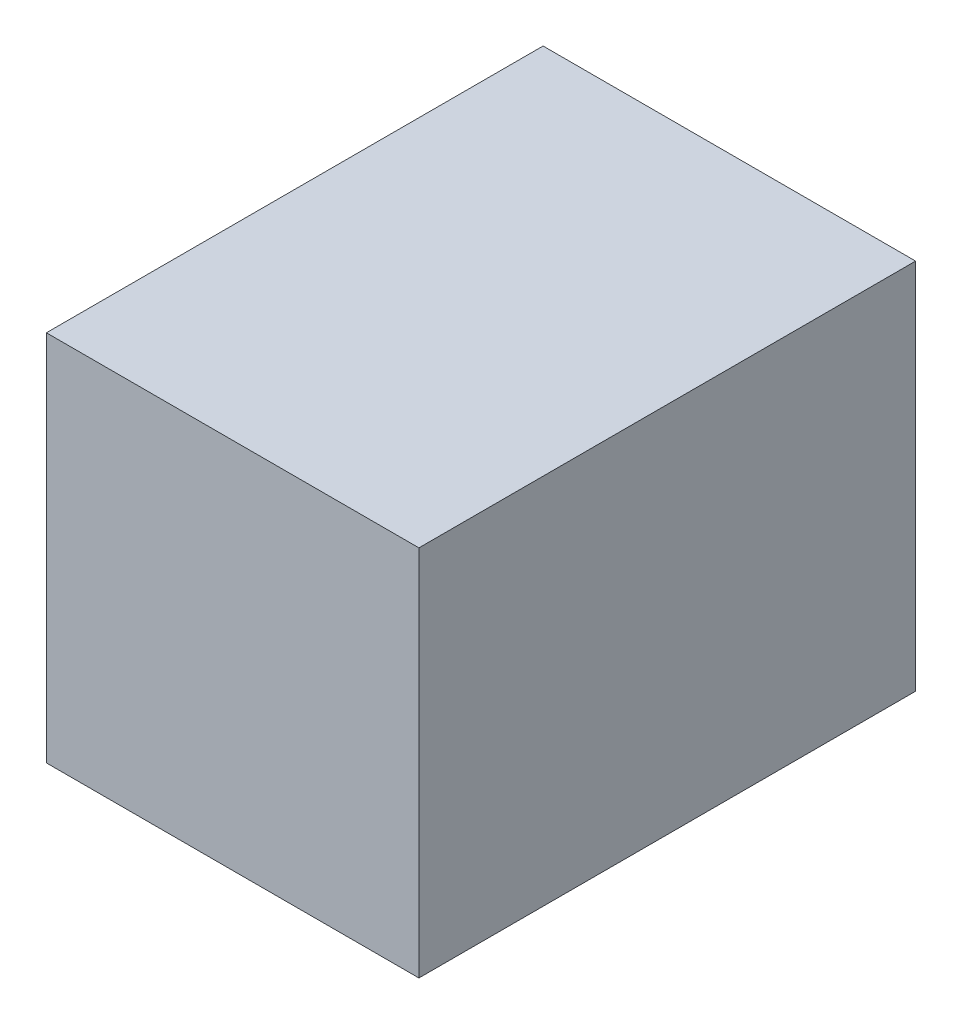
ISO-10303-21;
HEADER;
FILE_DESCRIPTION(('STEP AP214'),'2;1');
FILE_NAME('part.step','',(''),(''),'','','');
FILE_SCHEMA(('AUTOMOTIVE_DESIGN { 1 0 10303 214 1 1 1 1 }'));
ENDSEC;
DATA;
#1=APPLICATION_CONTEXT('core data for automotive mechanical design processes');
#2=APPLICATION_PROTOCOL_DEFINITION('international standard','automotive_design',2000,#1);
#3=PRODUCT_CONTEXT('',#1,'mechanical');
#4=PRODUCT('Part','Part','',(#3));
#5=PRODUCT_RELATED_PRODUCT_CATEGORY('part','',(#4));
#6=PRODUCT_DEFINITION_FORMATION('','',#4);
#7=PRODUCT_DEFINITION_CONTEXT('part definition',#1,'design');
#8=PRODUCT_DEFINITION('design','',#6,#7);
#9=PRODUCT_DEFINITION_SHAPE('','',#8);
#10=(LENGTH_UNIT() NAMED_UNIT(*) SI_UNIT(.MILLI.,.METRE.));
#11=(NAMED_UNIT(*) PLANE_ANGLE_UNIT() SI_UNIT($,.RADIAN.));
#12=(NAMED_UNIT(*) SI_UNIT($,.STERADIAN.) SOLID_ANGLE_UNIT());
#13=UNCERTAINTY_MEASURE_WITH_UNIT(LENGTH_MEASURE(1.E-05),#10,'distance_accuracy_value','');
#14=(GEOMETRIC_REPRESENTATION_CONTEXT(3) GLOBAL_UNCERTAINTY_ASSIGNED_CONTEXT((#13)) GLOBAL_UNIT_ASSIGNED_CONTEXT((#10,
#11,#12)) REPRESENTATION_CONTEXT('',''));
#15=CARTESIAN_POINT('',(0.,0.,0.));
#16=DIRECTION('',(0.,0.,1.));
#17=DIRECTION('',(1.,0.,0.));
#18=AXIS2_PLACEMENT_3D('',#15,#16,#17);
#19=CARTESIAN_POINT('',(5.24999999999932,-7.73900000000054,0.));
#20=DIRECTION('',(1.,0.,0.));
#21=DIRECTION('',(0.,0.,-1.));
#22=AXIS2_PLACEMENT_3D('',#19,#20,#21);
#23=PLANE('',#22);
#24=DIRECTION('',(0.,0.,-1.));
#25=VECTOR('',#24,1.);
#26=CARTESIAN_POINT('',(5.24999999999932,-7.73900000000054,0.));
#27=LINE('',#26,#25);
#28=CARTESIAN_POINT('',(5.24999999999932,-7.73900000000054,0.));
#29=VERTEX_POINT('',#28);
#30=CARTESIAN_POINT('',(5.24999999999932,-7.73900000000054,13.9999999999999));
#31=VERTEX_POINT('',#30);
#32=EDGE_CURVE('E20',#29,#31,#27,.F.);
#33=ORIENTED_EDGE('',*,*,#32,.F.);
#34=DIRECTION('',(0.,1.,0.));
#35=VECTOR('',#34,1.);
#36=CARTESIAN_POINT('',(5.24999999999932,0.,0.));
#37=LINE('',#36,#35);
#38=CARTESIAN_POINT('',(5.24999999999932,2.76100000000064,0.));
#39=VERTEX_POINT('',#38);
#40=EDGE_CURVE('E80',#29,#39,#37,.T.);
#41=ORIENTED_EDGE('',*,*,#40,.T.);
#42=DIRECTION('',(0.,0.,1.));
#43=VECTOR('',#42,1.);
#44=CARTESIAN_POINT('',(5.24999999999932,2.76100000000064,0.));
#45=LINE('',#44,#43);
#46=CARTESIAN_POINT('',(5.24999999999932,2.76100000000064,13.9999999999999));
#47=VERTEX_POINT('',#46);
#48=EDGE_CURVE('E61',#47,#39,#45,.F.);
#49=ORIENTED_EDGE('',*,*,#48,.F.);
#50=DIRECTION('',(0.,1.,0.));
#51=VECTOR('',#50,1.);
#52=CARTESIAN_POINT('',(5.24999999999932,0.,13.9999999999999));
#53=LINE('',#52,#51);
#54=EDGE_CURVE('E56',#31,#47,#53,.T.);
#55=ORIENTED_EDGE('',*,*,#54,.F.);
#56=EDGE_LOOP('',(#33,#41,#49,#55));
#57=FACE_BOUND('',#56,.T.);
#58=ADVANCED_FACE('F17',(#57),#23,.T.);
#59=CARTESIAN_POINT('',(-5.24999999999932,-7.73900000000054,0.));
#60=DIRECTION('',(0.,-1.,0.));
#61=DIRECTION('',(0.,0.,-1.));
#62=AXIS2_PLACEMENT_3D('',#59,#60,#61);
#63=PLANE('',#62);
#64=DIRECTION('',(0.,0.,1.));
#65=VECTOR('',#64,1.);
#66=CARTESIAN_POINT('',(-5.24999999999932,-7.73900000000054,0.));
#67=LINE('',#66,#65);
#68=CARTESIAN_POINT('',(-5.24999999999932,-7.73900000000054,0.));
#69=VERTEX_POINT('',#68);
#70=CARTESIAN_POINT('',(-5.24999999999932,-7.73900000000054,13.9999999999999));
#71=VERTEX_POINT('',#70);
#72=EDGE_CURVE('E83',#69,#71,#67,.T.);
#73=ORIENTED_EDGE('',*,*,#72,.F.);
#74=DIRECTION('',(1.,0.,0.));
#75=VECTOR('',#74,1.);
#76=CARTESIAN_POINT('',(0.,-7.73900000000054,0.));
#77=LINE('',#76,#75);
#78=EDGE_CURVE('E68',#69,#29,#77,.T.);
#79=ORIENTED_EDGE('',*,*,#78,.T.);
#80=ORIENTED_EDGE('',*,*,#32,.T.);
#81=DIRECTION('',(1.,0.,0.));
#82=VECTOR('',#81,1.);
#83=CARTESIAN_POINT('',(0.,-7.73900000000054,13.9999999999999));
#84=LINE('',#83,#82);
#85=EDGE_CURVE('E63',#71,#31,#84,.T.);
#86=ORIENTED_EDGE('',*,*,#85,.F.);
#87=EDGE_LOOP('',(#73,#79,#80,#86));
#88=FACE_BOUND('',#87,.T.);
#89=ADVANCED_FACE('F65',(#88),#63,.T.);
#90=CARTESIAN_POINT('',(0.,0.,13.9999999999999));
#91=DIRECTION('',(0.,0.,1.));
#92=DIRECTION('',(1.,0.,0.));
#93=AXIS2_PLACEMENT_3D('',#90,#91,#92);
#94=PLANE('',#93);
#95=DIRECTION('',(0.,1.,0.));
#96=VECTOR('',#95,1.);
#97=CARTESIAN_POINT('',(-5.24999999999932,2.76100000000064,13.9999999999999));
#98=LINE('',#97,#96);
#99=CARTESIAN_POINT('',(-5.24999999999932,2.76100000000064,13.9999999999999));
#100=VERTEX_POINT('',#99);
#101=EDGE_CURVE('E72',#71,#100,#98,.T.);
#102=ORIENTED_EDGE('',*,*,#101,.F.);
#103=ORIENTED_EDGE('',*,*,#85,.T.);
#104=ORIENTED_EDGE('',*,*,#54,.T.);
#105=DIRECTION('',(1.,0.,0.));
#106=VECTOR('',#105,1.);
#107=CARTESIAN_POINT('',(5.24999999999932,2.76100000000064,13.9999999999999));
#108=LINE('',#107,#106);
#109=EDGE_CURVE('E74',#100,#47,#108,.T.);
#110=ORIENTED_EDGE('',*,*,#109,.F.);
#111=EDGE_LOOP('',(#102,#103,#104,#110));
#112=FACE_BOUND('',#111,.T.);
#113=ADVANCED_FACE('F70',(#112),#94,.T.);
#114=CARTESIAN_POINT('',(5.24999999999932,2.76100000000064,0.));
#115=DIRECTION('',(0.,1.,0.));
#116=DIRECTION('',(0.,0.,1.));
#117=AXIS2_PLACEMENT_3D('',#114,#115,#116);
#118=PLANE('',#117);
#119=ORIENTED_EDGE('',*,*,#48,.T.);
#120=DIRECTION('',(1.,0.,0.));
#121=VECTOR('',#120,1.);
#122=CARTESIAN_POINT('',(0.,2.76100000000064,0.));
#123=LINE('',#122,#121);
#124=CARTESIAN_POINT('',(-5.24999999999932,2.76100000000064,0.));
#125=VERTEX_POINT('',#124);
#126=EDGE_CURVE('E35',#39,#125,#123,.F.);
#127=ORIENTED_EDGE('',*,*,#126,.T.);
#128=DIRECTION('',(0.,0.,1.));
#129=VECTOR('',#128,1.);
#130=CARTESIAN_POINT('',(-5.24999999999932,2.76100000000064,0.));
#131=LINE('',#130,#129);
#132=EDGE_CURVE('E26',#100,#125,#131,.F.);
#133=ORIENTED_EDGE('',*,*,#132,.F.);
#134=ORIENTED_EDGE('',*,*,#109,.T.);
#135=EDGE_LOOP('',(#119,#127,#133,#134));
#136=FACE_BOUND('',#135,.T.);
#137=ADVANCED_FACE('F89',(#136),#118,.T.);
#138=CARTESIAN_POINT('',(0.,0.,0.));
#139=DIRECTION('',(0.,0.,1.));
#140=DIRECTION('',(1.,0.,0.));
#141=AXIS2_PLACEMENT_3D('',#138,#139,#140);
#142=PLANE('',#141);
#143=ORIENTED_EDGE('',*,*,#126,.F.);
#144=ORIENTED_EDGE('',*,*,#40,.F.);
#145=ORIENTED_EDGE('',*,*,#78,.F.);
#146=DIRECTION('',(0.,1.,0.));
#147=VECTOR('',#146,1.);
#148=CARTESIAN_POINT('',(-5.24999999999932,2.76100000000064,0.));
#149=LINE('',#148,#147);
#150=EDGE_CURVE('E11',#125,#69,#149,.F.);
#151=ORIENTED_EDGE('',*,*,#150,.F.);
#152=EDGE_LOOP('',(#143,#144,#145,#151));
#153=FACE_BOUND('',#152,.T.);
#154=ADVANCED_FACE('F91',(#153),#142,.F.);
#155=CARTESIAN_POINT('',(-5.24999999999932,2.76100000000064,0.));
#156=DIRECTION('',(-1.,0.,0.));
#157=DIRECTION('',(0.,0.,1.));
#158=AXIS2_PLACEMENT_3D('',#155,#156,#157);
#159=PLANE('',#158);
#160=ORIENTED_EDGE('',*,*,#132,.T.);
#161=ORIENTED_EDGE('',*,*,#150,.T.);
#162=ORIENTED_EDGE('',*,*,#72,.T.);
#163=ORIENTED_EDGE('',*,*,#101,.T.);
#164=EDGE_LOOP('',(#160,#161,#162,#163));
#165=FACE_BOUND('',#164,.T.);
#166=ADVANCED_FACE('F88',(#165),#159,.T.);
#167=CLOSED_SHELL('',(#58,#89,#113,#137,#154,#166));
#168=MANIFOLD_SOLID_BREP('B1',#167);
#169=ADVANCED_BREP_SHAPE_REPRESENTATION('',(#18,#168),#14);
#170=SHAPE_DEFINITION_REPRESENTATION(#9,#169);
ENDSEC;
END-ISO-10303-21;
